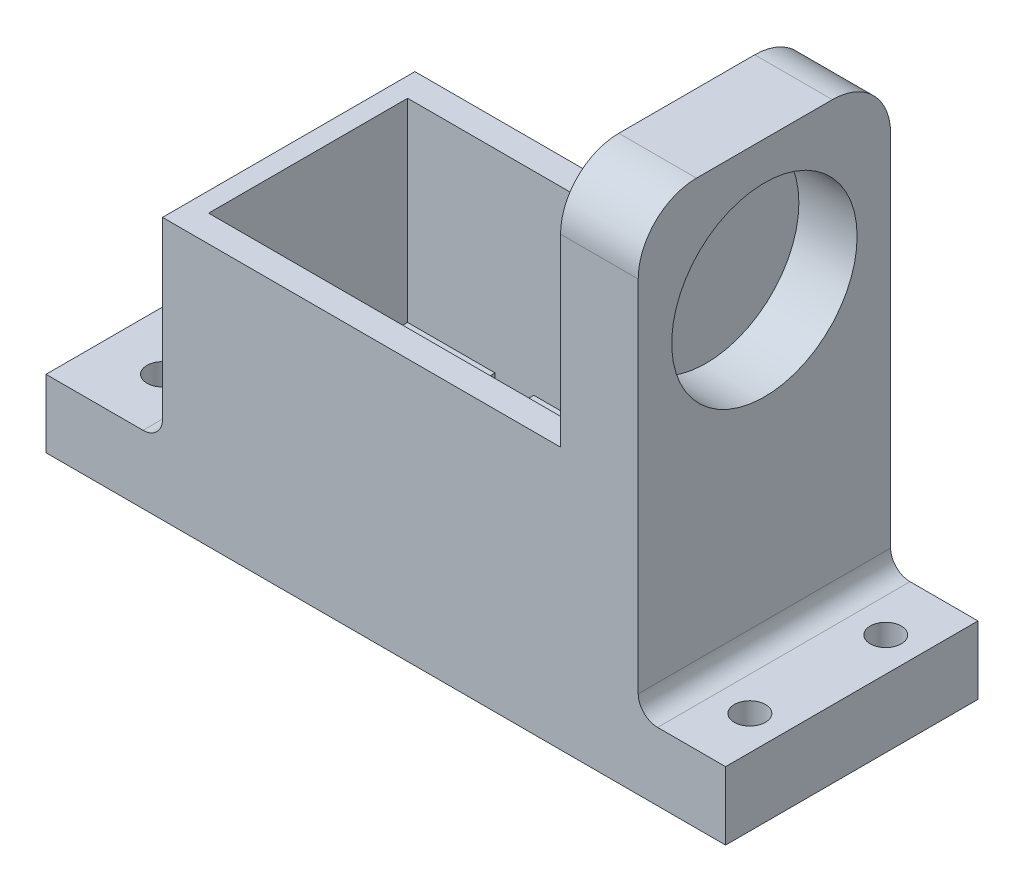
ISO-10303-21;
HEADER;
FILE_DESCRIPTION(('STEP AP214'),'2;1');
FILE_NAME('part.step','',(''),(''),'','','');
FILE_SCHEMA(('AUTOMOTIVE_DESIGN { 1 0 10303 214 1 1 1 1 }'));
ENDSEC;
DATA;
#1=APPLICATION_CONTEXT('core data for automotive mechanical design processes');
#2=APPLICATION_PROTOCOL_DEFINITION('international standard','automotive_design',2000,#1);
#3=PRODUCT_CONTEXT('',#1,'mechanical');
#4=PRODUCT('Part','Part','',(#3));
#5=PRODUCT_RELATED_PRODUCT_CATEGORY('part','',(#4));
#6=PRODUCT_DEFINITION_FORMATION('','',#4);
#7=PRODUCT_DEFINITION_CONTEXT('part definition',#1,'design');
#8=PRODUCT_DEFINITION('design','',#6,#7);
#9=PRODUCT_DEFINITION_SHAPE('','',#8);
#10=(LENGTH_UNIT() NAMED_UNIT(*) SI_UNIT(.MILLI.,.METRE.));
#11=(NAMED_UNIT(*) PLANE_ANGLE_UNIT() SI_UNIT($,.RADIAN.));
#12=(NAMED_UNIT(*) SI_UNIT($,.STERADIAN.) SOLID_ANGLE_UNIT());
#13=UNCERTAINTY_MEASURE_WITH_UNIT(LENGTH_MEASURE(1.E-05),#10,'distance_accuracy_value','');
#14=(GEOMETRIC_REPRESENTATION_CONTEXT(3) GLOBAL_UNCERTAINTY_ASSIGNED_CONTEXT((#13)) GLOBAL_UNIT_ASSIGNED_CONTEXT((#10,
#11,#12)) REPRESENTATION_CONTEXT('',''));
#15=CARTESIAN_POINT('',(0.,0.,0.));
#16=DIRECTION('',(0.,0.,1.));
#17=DIRECTION('',(1.,0.,0.));
#18=AXIS2_PLACEMENT_3D('',#15,#16,#17);
#19=CARTESIAN_POINT('',(0.,7.,0.));
#20=DIRECTION('',(0.,-1.,0.));
#21=DIRECTION('',(0.,0.,-1.));
#22=AXIS2_PLACEMENT_3D('',#19,#20,#21);
#23=PLANE('',#22);
#24=DIRECTION('',(0.,0.,1.));
#25=VECTOR('',#24,1.);
#26=CARTESIAN_POINT('',(23.,7.,-23.25));
#27=LINE('',#26,#25);
#28=CARTESIAN_POINT('',(23.,7.,-23.25));
#29=VERTEX_POINT('',#28);
#30=CARTESIAN_POINT('',(23.,7.,-2.75000000000001));
#31=VERTEX_POINT('',#30);
#32=EDGE_CURVE('E216',#29,#31,#27,.T.);
#33=ORIENTED_EDGE('',*,*,#32,.F.);
#34=DIRECTION('',(1.,0.,0.));
#35=VECTOR('',#34,1.);
#36=CARTESIAN_POINT('',(53.,7.,-23.25));
#37=LINE('',#36,#35);
#38=CARTESIAN_POINT('',(14.,7.,-23.25));
#39=VERTEX_POINT('',#38);
#40=EDGE_CURVE('E209',#39,#29,#37,.T.);
#41=ORIENTED_EDGE('',*,*,#40,.F.);
#42=DIRECTION('',(0.,0.,-1.));
#43=VECTOR('',#42,1.);
#44=CARTESIAN_POINT('',(14.,7.,-23.25));
#45=LINE('',#44,#43);
#46=CARTESIAN_POINT('',(14.,7.,-2.75));
#47=VERTEX_POINT('',#46);
#48=EDGE_CURVE('E241',#47,#39,#45,.T.);
#49=ORIENTED_EDGE('',*,*,#48,.F.);
#50=DIRECTION('',(-1.,0.,0.));
#51=VECTOR('',#50,1.);
#52=CARTESIAN_POINT('',(14.,7.,-2.75));
#53=LINE('',#52,#51);
#54=EDGE_CURVE('E199',#31,#47,#53,.T.);
#55=ORIENTED_EDGE('',*,*,#54,.F.);
#56=EDGE_LOOP('',(#33,#41,#49,#55));
#57=FACE_BOUND('',#56,.T.);
#58=ADVANCED_FACE('F34',(#57),#23,.F.);
#59=CARTESIAN_POINT('',(52.,7.,-2.75));
#60=VERTEX_POINT('',#59);
#61=CARTESIAN_POINT('',(27.,7.,-2.75));
#62=VERTEX_POINT('',#61);
#63=EDGE_CURVE('E238',#60,#62,#53,.T.);
#64=ORIENTED_EDGE('',*,*,#63,.F.);
#65=DIRECTION('',(0.,0.,1.));
#66=VECTOR('',#65,1.);
#67=CARTESIAN_POINT('',(52.,7.,-23.25));
#68=LINE('',#67,#66);
#69=CARTESIAN_POINT('',(52.,7.,-23.25));
#70=VERTEX_POINT('',#69);
#71=EDGE_CURVE('E425',#60,#70,#68,.F.);
#72=ORIENTED_EDGE('',*,*,#71,.T.);
#73=CARTESIAN_POINT('',(27.,7.,-23.25));
#74=VERTEX_POINT('',#73);
#75=EDGE_CURVE('E257',#74,#70,#37,.T.);
#76=ORIENTED_EDGE('',*,*,#75,.F.);
#77=DIRECTION('',(0.,0.,-1.));
#78=VECTOR('',#77,1.);
#79=CARTESIAN_POINT('',(27.,7.,-2.75000000000001));
#80=LINE('',#79,#78);
#81=EDGE_CURVE('E210',#62,#74,#80,.T.);
#82=ORIENTED_EDGE('',*,*,#81,.F.);
#83=EDGE_LOOP('',(#64,#72,#76,#82));
#84=FACE_BOUND('',#83,.T.);
#85=ADVANCED_FACE('F440',(#84),#23,.F.);
#86=CARTESIAN_POINT('',(6.,7.,-6.00000000000001));
#87=DIRECTION('',(0.,1.,0.));
#88=DIRECTION('',(0.,0.,-1.));
#89=AXIS2_PLACEMENT_3D('',#86,#87,#88);
#90=CIRCLE('',#89,1.6);
#91=CARTESIAN_POINT('',(6.,7.,-7.60000000000001));
#92=VERTEX_POINT('',#91);
#93=EDGE_CURVE('E499',#92,#92,#90,.T.);
#94=ORIENTED_EDGE('',*,*,#93,.F.);
#95=EDGE_LOOP('',(#94));
#96=FACE_BOUND('',#95,.T.);
#97=CARTESIAN_POINT('',(6.,7.,-20.));
#98=DIRECTION('',(0.,1.,0.));
#99=DIRECTION('',(0.,0.,1.));
#100=AXIS2_PLACEMENT_3D('',#97,#98,#99);
#101=CIRCLE('',#100,1.6);
#102=CARTESIAN_POINT('',(6.,7.,-18.4));
#103=VERTEX_POINT('',#102);
#104=EDGE_CURVE('E482',#103,#103,#101,.T.);
#105=ORIENTED_EDGE('',*,*,#104,.F.);
#106=EDGE_LOOP('',(#105));
#107=FACE_BOUND('',#106,.T.);
#108=DIRECTION('',(1.,0.,0.));
#109=VECTOR('',#108,1.);
#110=CARTESIAN_POINT('',(70.,7.,0.));
#111=LINE('',#110,#109);
#112=CARTESIAN_POINT('',(0.,7.,0.));
#113=VERTEX_POINT('',#112);
#114=CARTESIAN_POINT('',(10.,7.,0.));
#115=VERTEX_POINT('',#114);
#116=EDGE_CURVE('E296',#113,#115,#111,.T.);
#117=ORIENTED_EDGE('',*,*,#116,.T.);
#118=DIRECTION('',(0.,0.,1.));
#119=VECTOR('',#118,1.);
#120=CARTESIAN_POINT('',(10.,7.,-26.));
#121=LINE('',#120,#119);
#122=CARTESIAN_POINT('',(10.,7.,-26.));
#123=VERTEX_POINT('',#122);
#124=EDGE_CURVE('E317',#115,#123,#121,.F.);
#125=ORIENTED_EDGE('',*,*,#124,.T.);
#126=DIRECTION('',(-1.,0.,0.));
#127=VECTOR('',#126,1.);
#128=CARTESIAN_POINT('',(0.,7.,-26.));
#129=LINE('',#128,#127);
#130=CARTESIAN_POINT('',(0.,7.,-26.));
#131=VERTEX_POINT('',#130);
#132=EDGE_CURVE('E305',#123,#131,#129,.T.);
#133=ORIENTED_EDGE('',*,*,#132,.T.);
#134=DIRECTION('',(0.,0.,1.));
#135=VECTOR('',#134,1.);
#136=CARTESIAN_POINT('',(0.,7.,0.));
#137=LINE('',#136,#135);
#138=EDGE_CURVE('E304',#131,#113,#137,.T.);
#139=ORIENTED_EDGE('',*,*,#138,.T.);
#140=EDGE_LOOP('',(#117,#125,#133,#139));
#141=FACE_BOUND('',#140,.T.);
#142=ADVANCED_FACE('F414',(#96,#107,#141),#23,.F.);
#143=CARTESIAN_POINT('',(53.,52.,-26.));
#144=DIRECTION('',(1.,0.,0.));
#145=DIRECTION('',(0.,0.,-1.));
#146=AXIS2_PLACEMENT_3D('',#143,#144,#145);
#147=PLANE('',#146);
#148=DIRECTION('',(0.,0.,1.));
#149=VECTOR('',#148,1.);
#150=CARTESIAN_POINT('',(53.,52.,-26.));
#151=LINE('',#150,#149);
#152=CARTESIAN_POINT('',(53.,52.,-20.));
#153=VERTEX_POINT('',#152);
#154=CARTESIAN_POINT('',(53.,52.,-6.));
#155=VERTEX_POINT('',#154);
#156=EDGE_CURVE('E279',#153,#155,#151,.T.);
#157=ORIENTED_EDGE('',*,*,#156,.F.);
#158=CARTESIAN_POINT('',(53.,46.,-20.));
#159=DIRECTION('',(1.,0.,0.));
#160=DIRECTION('',(0.,0.,-1.));
#161=AXIS2_PLACEMENT_3D('',#158,#159,#160);
#162=CIRCLE('',#161,6.);
#163=CARTESIAN_POINT('',(53.,46.,-26.));
#164=VERTEX_POINT('',#163);
#165=EDGE_CURVE('E353',#153,#164,#162,.F.);
#166=ORIENTED_EDGE('',*,*,#165,.T.);
#167=DIRECTION('',(0.,-1.,0.));
#168=VECTOR('',#167,1.);
#169=CARTESIAN_POINT('',(53.,52.,-26.));
#170=LINE('',#169,#168);
#171=CARTESIAN_POINT('',(53.,27.,-26.));
#172=VERTEX_POINT('',#171);
#173=EDGE_CURVE('E344',#164,#172,#170,.T.);
#174=ORIENTED_EDGE('',*,*,#173,.T.);
#175=DIRECTION('',(0.,0.,-1.));
#176=VECTOR('',#175,1.);
#177=CARTESIAN_POINT('',(53.,27.,-26.));
#178=LINE('',#177,#176);
#179=CARTESIAN_POINT('',(53.,27.,-23.25));
#180=VERTEX_POINT('',#179);
#181=EDGE_CURVE('E256',#180,#172,#178,.T.);
#182=ORIENTED_EDGE('',*,*,#181,.F.);
#183=DIRECTION('',(0.,-1.,0.));
#184=VECTOR('',#183,1.);
#185=CARTESIAN_POINT('',(53.,27.,-23.25));
#186=LINE('',#185,#184);
#187=CARTESIAN_POINT('',(53.,8.,-23.25));
#188=VERTEX_POINT('',#187);
#189=EDGE_CURVE('E261',#180,#188,#186,.T.);
#190=ORIENTED_EDGE('',*,*,#189,.T.);
#191=DIRECTION('',(0.,0.,1.));
#192=VECTOR('',#191,1.);
#193=CARTESIAN_POINT('',(53.,8.,-2.75000000000001));
#194=LINE('',#193,#192);
#195=CARTESIAN_POINT('',(53.,8.,-2.75));
#196=VERTEX_POINT('',#195);
#197=EDGE_CURVE('E233',#188,#196,#194,.T.);
#198=ORIENTED_EDGE('',*,*,#197,.T.);
#199=DIRECTION('',(0.,-1.,0.));
#200=VECTOR('',#199,1.);
#201=CARTESIAN_POINT('',(53.,27.,-2.75));
#202=LINE('',#201,#200);
#203=CARTESIAN_POINT('',(53.,27.,-2.75));
#204=VERTEX_POINT('',#203);
#205=EDGE_CURVE('E270',#204,#196,#202,.T.);
#206=ORIENTED_EDGE('',*,*,#205,.F.);
#207=DIRECTION('',(0.,0.,-1.));
#208=VECTOR('',#207,1.);
#209=CARTESIAN_POINT('',(53.,27.,-2.75));
#210=LINE('',#209,#208);
#211=CARTESIAN_POINT('',(53.,27.,0.));
#212=VERTEX_POINT('',#211);
#213=EDGE_CURVE('E452',#212,#204,#210,.T.);
#214=ORIENTED_EDGE('',*,*,#213,.F.);
#215=DIRECTION('',(0.,-1.,0.));
#216=VECTOR('',#215,1.);
#217=CARTESIAN_POINT('',(53.,52.,0.));
#218=LINE('',#217,#216);
#219=CARTESIAN_POINT('',(53.,46.,0.));
#220=VERTEX_POINT('',#219);
#221=EDGE_CURVE('E342',#220,#212,#218,.T.);
#222=ORIENTED_EDGE('',*,*,#221,.F.);
#223=CARTESIAN_POINT('',(53.,46.,-6.));
#224=DIRECTION('',(1.,0.,0.));
#225=DIRECTION('',(0.,0.,-1.));
#226=AXIS2_PLACEMENT_3D('',#223,#224,#225);
#227=CIRCLE('',#226,6.);
#228=EDGE_CURVE('E341',#220,#155,#227,.F.);
#229=ORIENTED_EDGE('',*,*,#228,.T.);
#230=EDGE_LOOP('',(#157,#166,#174,#182,#190,#198,#206,#214,#222,#229));
#231=FACE_BOUND('',#230,.T.);
#232=ADVANCED_FACE('F368',(#231),#147,.F.);
#233=CARTESIAN_POINT('',(66.5,7.,-6.));
#234=DIRECTION('',(0.,1.,0.));
#235=DIRECTION('',(0.,0.,-1.));
#236=AXIS2_PLACEMENT_3D('',#233,#234,#235);
#237=CIRCLE('',#236,1.60000000000001);
#238=CARTESIAN_POINT('',(66.5,7.,-7.6));
#239=VERTEX_POINT('',#238);
#240=EDGE_CURVE('E493',#239,#239,#237,.T.);
#241=ORIENTED_EDGE('',*,*,#240,.F.);
#242=EDGE_LOOP('',(#241));
#243=FACE_BOUND('',#242,.T.);
#244=CARTESIAN_POINT('',(66.5,7.,-20.));
#245=DIRECTION('',(0.,1.,0.));
#246=DIRECTION('',(0.,0.,1.));
#247=AXIS2_PLACEMENT_3D('',#244,#245,#246);
#248=CIRCLE('',#247,1.6);
#249=CARTESIAN_POINT('',(66.5,7.,-18.4));
#250=VERTEX_POINT('',#249);
#251=EDGE_CURVE('E488',#250,#250,#248,.T.);
#252=ORIENTED_EDGE('',*,*,#251,.F.);
#253=EDGE_LOOP('',(#252));
#254=FACE_BOUND('',#253,.T.);
#255=CARTESIAN_POINT('',(70.,7.,-26.));
#256=VERTEX_POINT('',#255);
#257=CARTESIAN_POINT('',(63.,7.,-26.));
#258=VERTEX_POINT('',#257);
#259=EDGE_CURVE('E301',#256,#258,#129,.T.);
#260=ORIENTED_EDGE('',*,*,#259,.T.);
#261=DIRECTION('',(0.,0.,-1.));
#262=VECTOR('',#261,1.);
#263=CARTESIAN_POINT('',(63.,7.,0.));
#264=LINE('',#263,#262);
#265=CARTESIAN_POINT('',(63.,7.,0.));
#266=VERTEX_POINT('',#265);
#267=EDGE_CURVE('E320',#258,#266,#264,.F.);
#268=ORIENTED_EDGE('',*,*,#267,.T.);
#269=CARTESIAN_POINT('',(70.,7.,0.));
#270=VERTEX_POINT('',#269);
#271=EDGE_CURVE('E292',#266,#270,#111,.T.);
#272=ORIENTED_EDGE('',*,*,#271,.T.);
#273=DIRECTION('',(0.,0.,-1.));
#274=VECTOR('',#273,1.);
#275=CARTESIAN_POINT('',(70.,7.,-26.));
#276=LINE('',#275,#274);
#277=EDGE_CURVE('E288',#270,#256,#276,.T.);
#278=ORIENTED_EDGE('',*,*,#277,.T.);
#279=EDGE_LOOP('',(#260,#268,#272,#278));
#280=FACE_BOUND('',#279,.T.);
#281=ADVANCED_FACE('F383',(#243,#254,#280),#23,.F.);
#282=CARTESIAN_POINT('',(70.,7.,0.));
#283=DIRECTION('',(0.,0.,-1.));
#284=DIRECTION('',(-1.,0.,0.));
#285=AXIS2_PLACEMENT_3D('',#282,#283,#284);
#286=PLANE('',#285);
#287=DIRECTION('',(0.,-1.,0.));
#288=VECTOR('',#287,1.);
#289=CARTESIAN_POINT('',(61.,52.,0.));
#290=LINE('',#289,#288);
#291=CARTESIAN_POINT('',(61.,46.,0.));
#292=VERTEX_POINT('',#291);
#293=CARTESIAN_POINT('',(61.,9.00000000000001,0.));
#294=VERTEX_POINT('',#293);
#295=EDGE_CURVE('E345',#292,#294,#290,.T.);
#296=ORIENTED_EDGE('',*,*,#295,.F.);
#297=DIRECTION('',(1.,0.,0.));
#298=VECTOR('',#297,1.);
#299=CARTESIAN_POINT('',(53.,46.,0.));
#300=LINE('',#299,#298);
#301=EDGE_CURVE('E11',#292,#220,#300,.F.);
#302=ORIENTED_EDGE('',*,*,#301,.T.);
#303=ORIENTED_EDGE('',*,*,#221,.T.);
#304=DIRECTION('',(1.,0.,0.));
#305=VECTOR('',#304,1.);
#306=CARTESIAN_POINT('',(12.,27.,0.));
#307=LINE('',#306,#305);
#308=CARTESIAN_POINT('',(12.,27.,0.));
#309=VERTEX_POINT('',#308);
#310=EDGE_CURVE('E456',#309,#212,#307,.T.);
#311=ORIENTED_EDGE('',*,*,#310,.F.);
#312=DIRECTION('',(0.,-1.,0.));
#313=VECTOR('',#312,1.);
#314=CARTESIAN_POINT('',(12.,27.,0.));
#315=LINE('',#314,#313);
#316=CARTESIAN_POINT('',(12.,9.,0.));
#317=VERTEX_POINT('',#316);
#318=EDGE_CURVE('E273',#309,#317,#315,.T.);
#319=ORIENTED_EDGE('',*,*,#318,.T.);
#320=CARTESIAN_POINT('',(10.,9.,0.));
#321=DIRECTION('',(0.,0.,-1.));
#322=DIRECTION('',(-1.,0.,0.));
#323=AXIS2_PLACEMENT_3D('',#320,#321,#322);
#324=CIRCLE('',#323,2.);
#325=EDGE_CURVE('E322',#317,#115,#324,.T.);
#326=ORIENTED_EDGE('',*,*,#325,.T.);
#327=ORIENTED_EDGE('',*,*,#116,.F.);
#328=DIRECTION('',(0.,-1.,0.));
#329=VECTOR('',#328,1.);
#330=CARTESIAN_POINT('',(0.,7.,0.));
#331=LINE('',#330,#329);
#332=CARTESIAN_POINT('',(0.,0.,0.));
#333=VERTEX_POINT('',#332);
#334=EDGE_CURVE('E394',#113,#333,#331,.T.);
#335=ORIENTED_EDGE('',*,*,#334,.T.);
#336=DIRECTION('',(1.,0.,0.));
#337=VECTOR('',#336,1.);
#338=CARTESIAN_POINT('',(70.,0.,0.));
#339=LINE('',#338,#337);
#340=CARTESIAN_POINT('',(70.,0.,0.));
#341=VERTEX_POINT('',#340);
#342=EDGE_CURVE('E347',#333,#341,#339,.T.);
#343=ORIENTED_EDGE('',*,*,#342,.T.);
#344=DIRECTION('',(0.,-1.,0.));
#345=VECTOR('',#344,1.);
#346=CARTESIAN_POINT('',(70.,7.,0.));
#347=LINE('',#346,#345);
#348=EDGE_CURVE('E237',#270,#341,#347,.T.);
#349=ORIENTED_EDGE('',*,*,#348,.F.);
#350=ORIENTED_EDGE('',*,*,#271,.F.);
#351=CARTESIAN_POINT('',(63.,9.,0.));
#352=DIRECTION('',(0.,0.,-1.));
#353=DIRECTION('',(-1.,0.,0.));
#354=AXIS2_PLACEMENT_3D('',#351,#352,#353);
#355=CIRCLE('',#354,2.);
#356=EDGE_CURVE('E332',#266,#294,#355,.T.);
#357=ORIENTED_EDGE('',*,*,#356,.T.);
#358=EDGE_LOOP('',(#296,#302,#303,#311,#319,#326,#327,#335,#343,#349,#350,#357));
#359=FACE_BOUND('',#358,.T.);
#360=ADVANCED_FACE('F373',(#359),#286,.F.);
#361=CARTESIAN_POINT('',(70.,7.,-26.));
#362=DIRECTION('',(-1.,0.,0.));
#363=DIRECTION('',(0.,0.,1.));
#364=AXIS2_PLACEMENT_3D('',#361,#362,#363);
#365=PLANE('',#364);
#366=DIRECTION('',(0.,0.,-1.));
#367=VECTOR('',#366,1.);
#368=CARTESIAN_POINT('',(70.,0.,-26.));
#369=LINE('',#368,#367);
#370=CARTESIAN_POINT('',(70.,0.,-26.));
#371=VERTEX_POINT('',#370);
#372=EDGE_CURVE('E390',#341,#371,#369,.T.);
#373=ORIENTED_EDGE('',*,*,#372,.T.);
#374=DIRECTION('',(0.,-1.,0.));
#375=VECTOR('',#374,1.);
#376=CARTESIAN_POINT('',(70.,7.,-26.));
#377=LINE('',#376,#375);
#378=EDGE_CURVE('E388',#256,#371,#377,.T.);
#379=ORIENTED_EDGE('',*,*,#378,.F.);
#380=ORIENTED_EDGE('',*,*,#277,.F.);
#381=ORIENTED_EDGE('',*,*,#348,.T.);
#382=EDGE_LOOP('',(#373,#379,#380,#381));
#383=FACE_BOUND('',#382,.T.);
#384=ADVANCED_FACE('F389',(#383),#365,.F.);
#385=CARTESIAN_POINT('',(0.,7.,-26.));
#386=DIRECTION('',(0.,0.,1.));
#387=DIRECTION('',(1.,0.,0.));
#388=AXIS2_PLACEMENT_3D('',#385,#386,#387);
#389=PLANE('',#388);
#390=ORIENTED_EDGE('',*,*,#173,.F.);
#391=DIRECTION('',(-1.,0.,0.));
#392=VECTOR('',#391,1.);
#393=CARTESIAN_POINT('',(61.,46.,-26.));
#394=LINE('',#393,#392);
#395=CARTESIAN_POINT('',(61.,46.,-26.));
#396=VERTEX_POINT('',#395);
#397=EDGE_CURVE('E57',#164,#396,#394,.F.);
#398=ORIENTED_EDGE('',*,*,#397,.T.);
#399=DIRECTION('',(0.,-1.,0.));
#400=VECTOR('',#399,1.);
#401=CARTESIAN_POINT('',(61.,52.,-26.));
#402=LINE('',#401,#400);
#403=CARTESIAN_POINT('',(61.,9.00000000000001,-26.));
#404=VERTEX_POINT('',#403);
#405=EDGE_CURVE('E285',#396,#404,#402,.T.);
#406=ORIENTED_EDGE('',*,*,#405,.T.);
#407=CARTESIAN_POINT('',(63.,9.,-26.));
#408=DIRECTION('',(0.,0.,1.));
#409=DIRECTION('',(1.,0.,0.));
#410=AXIS2_PLACEMENT_3D('',#407,#408,#409);
#411=CIRCLE('',#410,2.);
#412=EDGE_CURVE('E330',#404,#258,#411,.T.);
#413=ORIENTED_EDGE('',*,*,#412,.T.);
#414=ORIENTED_EDGE('',*,*,#259,.F.);
#415=ORIENTED_EDGE('',*,*,#378,.T.);
#416=DIRECTION('',(-1.,0.,0.));
#417=VECTOR('',#416,1.);
#418=CARTESIAN_POINT('',(0.,0.,-26.));
#419=LINE('',#418,#417);
#420=CARTESIAN_POINT('',(0.,0.,-26.));
#421=VERTEX_POINT('',#420);
#422=EDGE_CURVE('E401',#371,#421,#419,.T.);
#423=ORIENTED_EDGE('',*,*,#422,.T.);
#424=DIRECTION('',(0.,-1.,0.));
#425=VECTOR('',#424,1.);
#426=CARTESIAN_POINT('',(0.,7.,-26.));
#427=LINE('',#426,#425);
#428=EDGE_CURVE('E392',#131,#421,#427,.T.);
#429=ORIENTED_EDGE('',*,*,#428,.F.);
#430=ORIENTED_EDGE('',*,*,#132,.F.);
#431=CARTESIAN_POINT('',(10.,9.,-26.));
#432=DIRECTION('',(0.,0.,1.));
#433=DIRECTION('',(1.,0.,0.));
#434=AXIS2_PLACEMENT_3D('',#431,#432,#433);
#435=CIRCLE('',#434,2.);
#436=CARTESIAN_POINT('',(12.,9.,-26.));
#437=VERTEX_POINT('',#436);
#438=EDGE_CURVE('E326',#123,#437,#435,.T.);
#439=ORIENTED_EDGE('',*,*,#438,.T.);
#440=DIRECTION('',(0.,-1.,0.));
#441=VECTOR('',#440,1.);
#442=CARTESIAN_POINT('',(12.,27.,-26.));
#443=LINE('',#442,#441);
#444=CARTESIAN_POINT('',(12.,27.,-26.));
#445=VERTEX_POINT('',#444);
#446=EDGE_CURVE('E276',#445,#437,#443,.T.);
#447=ORIENTED_EDGE('',*,*,#446,.F.);
#448=DIRECTION('',(-1.,0.,0.));
#449=VECTOR('',#448,1.);
#450=CARTESIAN_POINT('',(53.,27.,-26.));
#451=LINE('',#450,#449);
#452=EDGE_CURVE('E461',#172,#445,#451,.T.);
#453=ORIENTED_EDGE('',*,*,#452,.F.);
#454=EDGE_LOOP('',(#390,#398,#406,#413,#414,#415,#423,#429,#430,#439,#447,#453));
#455=FACE_BOUND('',#454,.T.);
#456=ADVANCED_FACE('F381',(#455),#389,.F.);
#457=CARTESIAN_POINT('',(0.,7.,0.));
#458=DIRECTION('',(1.,0.,0.));
#459=DIRECTION('',(0.,0.,-1.));
#460=AXIS2_PLACEMENT_3D('',#457,#458,#459);
#461=PLANE('',#460);
#462=DIRECTION('',(0.,0.,1.));
#463=VECTOR('',#462,1.);
#464=CARTESIAN_POINT('',(0.,0.,0.));
#465=LINE('',#464,#463);
#466=EDGE_CURVE('E399',#421,#333,#465,.T.);
#467=ORIENTED_EDGE('',*,*,#466,.T.);
#468=ORIENTED_EDGE('',*,*,#334,.F.);
#469=ORIENTED_EDGE('',*,*,#138,.F.);
#470=ORIENTED_EDGE('',*,*,#428,.T.);
#471=EDGE_LOOP('',(#467,#468,#469,#470));
#472=FACE_BOUND('',#471,.T.);
#473=ADVANCED_FACE('F412',(#472),#461,.F.);
#474=CARTESIAN_POINT('',(0.,0.,0.));
#475=DIRECTION('',(0.,-1.,0.));
#476=DIRECTION('',(0.,0.,-1.));
#477=AXIS2_PLACEMENT_3D('',#474,#475,#476);
#478=PLANE('',#477);
#479=CARTESIAN_POINT('',(6.,0.,-6.00000000000001));
#480=DIRECTION('',(0.,-1.,0.));
#481=DIRECTION('',(0.,0.,-1.));
#482=AXIS2_PLACEMENT_3D('',#479,#480,#481);
#483=CIRCLE('',#482,1.6);
#484=CARTESIAN_POINT('',(6.,0.,-7.60000000000001));
#485=VERTEX_POINT('',#484);
#486=EDGE_CURVE('E502',#485,#485,#483,.F.);
#487=ORIENTED_EDGE('',*,*,#486,.T.);
#488=EDGE_LOOP('',(#487));
#489=FACE_BOUND('',#488,.T.);
#490=CARTESIAN_POINT('',(66.5,0.,-6.));
#491=DIRECTION('',(0.,-1.,0.));
#492=DIRECTION('',(0.,0.,-1.));
#493=AXIS2_PLACEMENT_3D('',#490,#491,#492);
#494=CIRCLE('',#493,1.60000000000001);
#495=CARTESIAN_POINT('',(66.5,0.,-7.6));
#496=VERTEX_POINT('',#495);
#497=EDGE_CURVE('E496',#496,#496,#494,.F.);
#498=ORIENTED_EDGE('',*,*,#497,.T.);
#499=EDGE_LOOP('',(#498));
#500=FACE_BOUND('',#499,.T.);
#501=CARTESIAN_POINT('',(66.5,0.,-20.));
#502=DIRECTION('',(0.,-1.,0.));
#503=DIRECTION('',(0.,0.,-1.));
#504=AXIS2_PLACEMENT_3D('',#501,#502,#503);
#505=CIRCLE('',#504,1.6);
#506=CARTESIAN_POINT('',(66.5,0.,-21.6));
#507=VERTEX_POINT('',#506);
#508=EDGE_CURVE('E490',#507,#507,#505,.F.);
#509=ORIENTED_EDGE('',*,*,#508,.T.);
#510=EDGE_LOOP('',(#509));
#511=FACE_BOUND('',#510,.T.);
#512=CARTESIAN_POINT('',(6.,0.,-20.));
#513=DIRECTION('',(0.,-1.,0.));
#514=DIRECTION('',(0.,0.,-1.));
#515=AXIS2_PLACEMENT_3D('',#512,#513,#514);
#516=CIRCLE('',#515,1.6);
#517=CARTESIAN_POINT('',(6.,0.,-21.6));
#518=VERTEX_POINT('',#517);
#519=EDGE_CURVE('E484',#518,#518,#516,.F.);
#520=ORIENTED_EDGE('',*,*,#519,.T.);
#521=EDGE_LOOP('',(#520));
#522=FACE_BOUND('',#521,.T.);
#523=DIRECTION('',(-1.,0.,0.));
#524=VECTOR('',#523,1.);
#525=CARTESIAN_POINT('',(27.,0.,-23.25));
#526=LINE('',#525,#524);
#527=CARTESIAN_POINT('',(27.,0.,-23.25));
#528=VERTEX_POINT('',#527);
#529=CARTESIAN_POINT('',(23.,0.,-23.25));
#530=VERTEX_POINT('',#529);
#531=EDGE_CURVE('E206',#528,#530,#526,.T.);
#532=ORIENTED_EDGE('',*,*,#531,.T.);
#533=DIRECTION('',(0.,0.,1.));
#534=VECTOR('',#533,1.);
#535=CARTESIAN_POINT('',(23.,0.,-23.25));
#536=LINE('',#535,#534);
#537=CARTESIAN_POINT('',(23.,0.,-2.75000000000001));
#538=VERTEX_POINT('',#537);
#539=EDGE_CURVE('E188',#530,#538,#536,.T.);
#540=ORIENTED_EDGE('',*,*,#539,.T.);
#541=DIRECTION('',(1.,0.,0.));
#542=VECTOR('',#541,1.);
#543=CARTESIAN_POINT('',(23.,0.,-2.75000000000001));
#544=LINE('',#543,#542);
#545=CARTESIAN_POINT('',(27.,0.,-2.75000000000001));
#546=VERTEX_POINT('',#545);
#547=EDGE_CURVE('E219',#538,#546,#544,.T.);
#548=ORIENTED_EDGE('',*,*,#547,.T.);
#549=DIRECTION('',(0.,0.,-1.));
#550=VECTOR('',#549,1.);
#551=CARTESIAN_POINT('',(27.,0.,-2.75000000000001));
#552=LINE('',#551,#550);
#553=EDGE_CURVE('E215',#546,#528,#552,.T.);
#554=ORIENTED_EDGE('',*,*,#553,.T.);
#555=EDGE_LOOP('',(#532,#540,#548,#554));
#556=FACE_BOUND('',#555,.T.);
#557=ORIENTED_EDGE('',*,*,#342,.F.);
#558=ORIENTED_EDGE('',*,*,#466,.F.);
#559=ORIENTED_EDGE('',*,*,#422,.F.);
#560=ORIENTED_EDGE('',*,*,#372,.F.);
#561=EDGE_LOOP('',(#557,#558,#559,#560));
#562=FACE_BOUND('',#561,.T.);
#563=ADVANCED_FACE('F213',(#489,#500,#511,#522,#556,#562),#478,.T.);
#564=CARTESIAN_POINT('',(61.,52.,0.));
#565=DIRECTION('',(-1.,0.,0.));
#566=DIRECTION('',(0.,0.,1.));
#567=AXIS2_PLACEMENT_3D('',#564,#565,#566);
#568=PLANE('',#567);
#569=CARTESIAN_POINT('',(61.,38.53,-13.));
#570=DIRECTION('',(1.,0.,0.));
#571=DIRECTION('',(0.,0.,-1.));
#572=AXIS2_PLACEMENT_3D('',#569,#570,#571);
#573=CIRCLE('',#572,9.55);
#574=CARTESIAN_POINT('',(61.,38.53,-22.55));
#575=VERTEX_POINT('',#574);
#576=EDGE_CURVE('E508',#575,#575,#573,.T.);
#577=ORIENTED_EDGE('',*,*,#576,.F.);
#578=EDGE_LOOP('',(#577));
#579=FACE_BOUND('',#578,.T.);
#580=ORIENTED_EDGE('',*,*,#405,.F.);
#581=CARTESIAN_POINT('',(61.,46.,-20.));
#582=DIRECTION('',(-1.,0.,0.));
#583=DIRECTION('',(0.,0.,1.));
#584=AXIS2_PLACEMENT_3D('',#581,#582,#583);
#585=CIRCLE('',#584,6.);
#586=CARTESIAN_POINT('',(61.,52.,-20.));
#587=VERTEX_POINT('',#586);
#588=EDGE_CURVE('E42',#396,#587,#585,.F.);
#589=ORIENTED_EDGE('',*,*,#588,.T.);
#590=DIRECTION('',(0.,0.,-1.));
#591=VECTOR('',#590,1.);
#592=CARTESIAN_POINT('',(61.,52.,0.));
#593=LINE('',#592,#591);
#594=CARTESIAN_POINT('',(61.,52.,-5.99999999999999));
#595=VERTEX_POINT('',#594);
#596=EDGE_CURVE('E282',#595,#587,#593,.T.);
#597=ORIENTED_EDGE('',*,*,#596,.F.);
#598=CARTESIAN_POINT('',(61.,46.,-6.));
#599=DIRECTION('',(-1.,0.,0.));
#600=DIRECTION('',(0.,0.,1.));
#601=AXIS2_PLACEMENT_3D('',#598,#599,#600);
#602=CIRCLE('',#601,6.);
#603=EDGE_CURVE('E49',#595,#292,#602,.F.);
#604=ORIENTED_EDGE('',*,*,#603,.T.);
#605=ORIENTED_EDGE('',*,*,#295,.T.);
#606=DIRECTION('',(0.,0.,-1.));
#607=VECTOR('',#606,1.);
#608=CARTESIAN_POINT('',(61.,9.,-26.));
#609=LINE('',#608,#607);
#610=EDGE_CURVE('E318',#294,#404,#609,.T.);
#611=ORIENTED_EDGE('',*,*,#610,.T.);
#612=EDGE_LOOP('',(#580,#589,#597,#604,#605,#611));
#613=FACE_BOUND('',#612,.T.);
#614=ADVANCED_FACE('F357',(#579,#613),#568,.F.);
#615=CARTESIAN_POINT('',(0.,52.,0.));
#616=DIRECTION('',(0.,1.,0.));
#617=DIRECTION('',(0.,0.,1.));
#618=AXIS2_PLACEMENT_3D('',#615,#616,#617);
#619=PLANE('',#618);
#620=ORIENTED_EDGE('',*,*,#596,.T.);
#621=DIRECTION('',(-1.,0.,0.));
#622=VECTOR('',#621,1.);
#623=CARTESIAN_POINT('',(53.,52.,-20.));
#624=LINE('',#623,#622);
#625=EDGE_CURVE('E338',#587,#153,#624,.T.);
#626=ORIENTED_EDGE('',*,*,#625,.T.);
#627=ORIENTED_EDGE('',*,*,#156,.T.);
#628=DIRECTION('',(1.,0.,0.));
#629=VECTOR('',#628,1.);
#630=CARTESIAN_POINT('',(61.,52.,-6.));
#631=LINE('',#630,#629);
#632=EDGE_CURVE('E335',#155,#595,#631,.T.);
#633=ORIENTED_EDGE('',*,*,#632,.T.);
#634=EDGE_LOOP('',(#620,#626,#627,#633));
#635=FACE_BOUND('',#634,.T.);
#636=ADVANCED_FACE('F361',(#635),#619,.T.);
#637=CARTESIAN_POINT('',(12.,27.,-26.));
#638=DIRECTION('',(1.,0.,0.));
#639=DIRECTION('',(0.,0.,-1.));
#640=AXIS2_PLACEMENT_3D('',#637,#638,#639);
#641=PLANE('',#640);
#642=ORIENTED_EDGE('',*,*,#446,.T.);
#643=DIRECTION('',(0.,0.,1.));
#644=VECTOR('',#643,1.);
#645=CARTESIAN_POINT('',(12.,9.,0.));
#646=LINE('',#645,#644);
#647=EDGE_CURVE('E315',#437,#317,#646,.T.);
#648=ORIENTED_EDGE('',*,*,#647,.T.);
#649=ORIENTED_EDGE('',*,*,#318,.F.);
#650=DIRECTION('',(0.,0.,1.));
#651=VECTOR('',#650,1.);
#652=CARTESIAN_POINT('',(12.,27.,-26.));
#653=LINE('',#652,#651);
#654=EDGE_CURVE('E459',#445,#309,#653,.T.);
#655=ORIENTED_EDGE('',*,*,#654,.F.);
#656=EDGE_LOOP('',(#642,#648,#649,#655));
#657=FACE_BOUND('',#656,.T.);
#658=ADVANCED_FACE('F466',(#657),#641,.F.);
#659=CARTESIAN_POINT('',(14.,27.,-2.75));
#660=DIRECTION('',(0.,0.,1.));
#661=DIRECTION('',(1.,0.,0.));
#662=AXIS2_PLACEMENT_3D('',#659,#660,#661);
#663=PLANE('',#662);
#664=ORIENTED_EDGE('',*,*,#205,.T.);
#665=CARTESIAN_POINT('',(52.,8.,-2.75));
#666=DIRECTION('',(0.,0.,1.));
#667=DIRECTION('',(1.,0.,0.));
#668=AXIS2_PLACEMENT_3D('',#665,#666,#667);
#669=CIRCLE('',#668,1.);
#670=EDGE_CURVE('E236',#196,#60,#669,.F.);
#671=ORIENTED_EDGE('',*,*,#670,.T.);
#672=ORIENTED_EDGE('',*,*,#63,.T.);
#673=DIRECTION('',(0.,1.,0.));
#674=VECTOR('',#673,1.);
#675=CARTESIAN_POINT('',(27.,-0.00100000000000013,-2.75000000000001));
#676=LINE('',#675,#674);
#677=EDGE_CURVE('E230',#546,#62,#676,.T.);
#678=ORIENTED_EDGE('',*,*,#677,.F.);
#679=ORIENTED_EDGE('',*,*,#547,.F.);
#680=DIRECTION('',(0.,1.,0.));
#681=VECTOR('',#680,1.);
#682=CARTESIAN_POINT('',(23.,-0.00100000000000013,-2.75000000000001));
#683=LINE('',#682,#681);
#684=EDGE_CURVE('E194',#538,#31,#683,.T.);
#685=ORIENTED_EDGE('',*,*,#684,.T.);
#686=ORIENTED_EDGE('',*,*,#54,.T.);
#687=DIRECTION('',(0.,-1.,0.));
#688=VECTOR('',#687,1.);
#689=CARTESIAN_POINT('',(14.,27.,-2.75));
#690=LINE('',#689,#688);
#691=CARTESIAN_POINT('',(14.,27.,-2.75));
#692=VERTEX_POINT('',#691);
#693=EDGE_CURVE('E267',#692,#47,#690,.T.);
#694=ORIENTED_EDGE('',*,*,#693,.F.);
#695=DIRECTION('',(-1.,0.,0.));
#696=VECTOR('',#695,1.);
#697=CARTESIAN_POINT('',(14.,27.,-2.75));
#698=LINE('',#697,#696);
#699=EDGE_CURVE('E450',#204,#692,#698,.T.);
#700=ORIENTED_EDGE('',*,*,#699,.F.);
#701=EDGE_LOOP('',(#664,#671,#672,#678,#679,#685,#686,#694,#700));
#702=FACE_BOUND('',#701,.T.);
#703=ADVANCED_FACE('F433',(#702),#663,.F.);
#704=CARTESIAN_POINT('',(14.,27.,-23.25));
#705=DIRECTION('',(-1.,0.,0.));
#706=DIRECTION('',(0.,0.,1.));
#707=AXIS2_PLACEMENT_3D('',#704,#705,#706);
#708=PLANE('',#707);
#709=ORIENTED_EDGE('',*,*,#48,.T.);
#710=DIRECTION('',(0.,-1.,0.));
#711=VECTOR('',#710,1.);
#712=CARTESIAN_POINT('',(14.,27.,-23.25));
#713=LINE('',#712,#711);
#714=CARTESIAN_POINT('',(14.,27.,-23.25));
#715=VERTEX_POINT('',#714);
#716=EDGE_CURVE('E265',#715,#39,#713,.T.);
#717=ORIENTED_EDGE('',*,*,#716,.F.);
#718=DIRECTION('',(0.,0.,-1.));
#719=VECTOR('',#718,1.);
#720=CARTESIAN_POINT('',(14.,27.,-23.25));
#721=LINE('',#720,#719);
#722=EDGE_CURVE('E449',#692,#715,#721,.T.);
#723=ORIENTED_EDGE('',*,*,#722,.F.);
#724=ORIENTED_EDGE('',*,*,#693,.T.);
#725=EDGE_LOOP('',(#709,#717,#723,#724));
#726=FACE_BOUND('',#725,.T.);
#727=ADVANCED_FACE('F472',(#726),#708,.F.);
#728=CARTESIAN_POINT('',(53.,27.,-23.25));
#729=DIRECTION('',(0.,0.,-1.));
#730=DIRECTION('',(-1.,0.,0.));
#731=AXIS2_PLACEMENT_3D('',#728,#729,#730);
#732=PLANE('',#731);
#733=ORIENTED_EDGE('',*,*,#75,.T.);
#734=CARTESIAN_POINT('',(52.,8.,-23.25));
#735=DIRECTION('',(0.,0.,-1.));
#736=DIRECTION('',(-1.,0.,0.));
#737=AXIS2_PLACEMENT_3D('',#734,#735,#736);
#738=CIRCLE('',#737,1.);
#739=EDGE_CURVE('E424',#70,#188,#738,.F.);
#740=ORIENTED_EDGE('',*,*,#739,.T.);
#741=ORIENTED_EDGE('',*,*,#189,.F.);
#742=DIRECTION('',(1.,0.,0.));
#743=VECTOR('',#742,1.);
#744=CARTESIAN_POINT('',(53.,27.,-23.25));
#745=LINE('',#744,#743);
#746=EDGE_CURVE('E246',#715,#180,#745,.T.);
#747=ORIENTED_EDGE('',*,*,#746,.F.);
#748=ORIENTED_EDGE('',*,*,#716,.T.);
#749=ORIENTED_EDGE('',*,*,#40,.T.);
#750=DIRECTION('',(0.,1.,0.));
#751=VECTOR('',#750,1.);
#752=CARTESIAN_POINT('',(23.,-0.00100000000000013,-23.25));
#753=LINE('',#752,#751);
#754=EDGE_CURVE('E192',#530,#29,#753,.T.);
#755=ORIENTED_EDGE('',*,*,#754,.F.);
#756=ORIENTED_EDGE('',*,*,#531,.F.);
#757=DIRECTION('',(0.,1.,0.));
#758=VECTOR('',#757,1.);
#759=CARTESIAN_POINT('',(27.,-0.00100000000000013,-23.25));
#760=LINE('',#759,#758);
#761=EDGE_CURVE('E200',#528,#74,#760,.T.);
#762=ORIENTED_EDGE('',*,*,#761,.T.);
#763=EDGE_LOOP('',(#733,#740,#741,#747,#748,#749,#755,#756,#762));
#764=FACE_BOUND('',#763,.T.);
#765=ADVANCED_FACE('F205',(#764),#732,.F.);
#766=CARTESIAN_POINT('',(0.,27.,0.));
#767=DIRECTION('',(0.,-1.,0.));
#768=DIRECTION('',(0.,0.,-1.));
#769=AXIS2_PLACEMENT_3D('',#766,#767,#768);
#770=PLANE('',#769);
#771=ORIENTED_EDGE('',*,*,#181,.T.);
#772=ORIENTED_EDGE('',*,*,#452,.T.);
#773=ORIENTED_EDGE('',*,*,#654,.T.);
#774=ORIENTED_EDGE('',*,*,#310,.T.);
#775=ORIENTED_EDGE('',*,*,#213,.T.);
#776=ORIENTED_EDGE('',*,*,#699,.T.);
#777=ORIENTED_EDGE('',*,*,#722,.T.);
#778=ORIENTED_EDGE('',*,*,#746,.T.);
#779=EDGE_LOOP('',(#771,#772,#773,#774,#775,#776,#777,#778));
#780=FACE_BOUND('',#779,.T.);
#781=ADVANCED_FACE('F463',(#780),#770,.F.);
#782=CARTESIAN_POINT('',(27.,-0.00100000000000013,-2.75000000000001));
#783=DIRECTION('',(1.,0.,0.));
#784=DIRECTION('',(0.,0.,-1.));
#785=AXIS2_PLACEMENT_3D('',#782,#783,#784);
#786=PLANE('',#785);
#787=ORIENTED_EDGE('',*,*,#677,.T.);
#788=ORIENTED_EDGE('',*,*,#81,.T.);
#789=ORIENTED_EDGE('',*,*,#761,.F.);
#790=ORIENTED_EDGE('',*,*,#553,.F.);
#791=EDGE_LOOP('',(#787,#788,#789,#790));
#792=FACE_BOUND('',#791,.T.);
#793=ADVANCED_FACE('F476',(#792),#786,.F.);
#794=CARTESIAN_POINT('',(23.,-0.00100000000000013,-23.25));
#795=DIRECTION('',(-1.,0.,0.));
#796=DIRECTION('',(0.,0.,1.));
#797=AXIS2_PLACEMENT_3D('',#794,#795,#796);
#798=PLANE('',#797);
#799=ORIENTED_EDGE('',*,*,#754,.T.);
#800=ORIENTED_EDGE('',*,*,#32,.T.);
#801=ORIENTED_EDGE('',*,*,#684,.F.);
#802=ORIENTED_EDGE('',*,*,#539,.F.);
#803=EDGE_LOOP('',(#799,#800,#801,#802));
#804=FACE_BOUND('',#803,.T.);
#805=ADVANCED_FACE('F190',(#804),#798,.F.);
#806=CARTESIAN_POINT('',(52.,8.,-26.));
#807=DIRECTION('',(0.,0.,-1.));
#808=DIRECTION('',(-1.,0.,0.));
#809=AXIS2_PLACEMENT_3D('',#806,#807,#808);
#810=CYLINDRICAL_SURFACE('',#809,1.);
#811=ORIENTED_EDGE('',*,*,#739,.F.);
#812=ORIENTED_EDGE('',*,*,#71,.F.);
#813=ORIENTED_EDGE('',*,*,#670,.F.);
#814=ORIENTED_EDGE('',*,*,#197,.F.);
#815=EDGE_LOOP('',(#811,#812,#813,#814));
#816=FACE_BOUND('',#815,.T.);
#817=ADVANCED_FACE('F442',(#816),#810,.F.);
#818=CARTESIAN_POINT('',(10.,9.,-26.));
#819=DIRECTION('',(0.,0.,-1.));
#820=DIRECTION('',(-1.,0.,0.));
#821=AXIS2_PLACEMENT_3D('',#818,#819,#820);
#822=CYLINDRICAL_SURFACE('',#821,2.);
#823=ORIENTED_EDGE('',*,*,#438,.F.);
#824=ORIENTED_EDGE('',*,*,#124,.F.);
#825=ORIENTED_EDGE('',*,*,#325,.F.);
#826=ORIENTED_EDGE('',*,*,#647,.F.);
#827=EDGE_LOOP('',(#823,#824,#825,#826));
#828=FACE_BOUND('',#827,.T.);
#829=ADVANCED_FACE('F420',(#828),#822,.F.);
#830=CARTESIAN_POINT('',(63.,9.,0.));
#831=DIRECTION('',(0.,0.,1.));
#832=DIRECTION('',(1.,0.,0.));
#833=AXIS2_PLACEMENT_3D('',#830,#831,#832);
#834=CYLINDRICAL_SURFACE('',#833,2.);
#835=ORIENTED_EDGE('',*,*,#356,.F.);
#836=ORIENTED_EDGE('',*,*,#267,.F.);
#837=ORIENTED_EDGE('',*,*,#412,.F.);
#838=ORIENTED_EDGE('',*,*,#610,.F.);
#839=EDGE_LOOP('',(#835,#836,#837,#838));
#840=FACE_BOUND('',#839,.T.);
#841=ADVANCED_FACE('F379',(#840),#834,.F.);
#842=CARTESIAN_POINT('',(6.,-0.00102499999999998,-20.));
#843=DIRECTION('',(0.,1.,0.));
#844=DIRECTION('',(0.,0.,1.));
#845=AXIS2_PLACEMENT_3D('',#842,#843,#844);
#846=CYLINDRICAL_SURFACE('',#845,1.6);
#847=ORIENTED_EDGE('',*,*,#519,.F.);
#848=EDGE_LOOP('',(#847));
#849=FACE_BOUND('',#848,.T.);
#850=ORIENTED_EDGE('',*,*,#104,.T.);
#851=EDGE_LOOP('',(#850));
#852=FACE_BOUND('',#851,.T.);
#853=ADVANCED_FACE('F554',(#849,#852),#846,.F.);
#854=CARTESIAN_POINT('',(66.5,-0.00102499999999998,-20.));
#855=DIRECTION('',(0.,1.,0.));
#856=DIRECTION('',(0.,0.,1.));
#857=AXIS2_PLACEMENT_3D('',#854,#855,#856);
#858=CYLINDRICAL_SURFACE('',#857,1.6);
#859=ORIENTED_EDGE('',*,*,#508,.F.);
#860=EDGE_LOOP('',(#859));
#861=FACE_BOUND('',#860,.T.);
#862=ORIENTED_EDGE('',*,*,#251,.T.);
#863=EDGE_LOOP('',(#862));
#864=FACE_BOUND('',#863,.T.);
#865=ADVANCED_FACE('F556',(#861,#864),#858,.F.);
#866=CARTESIAN_POINT('',(66.5,-0.00102499999999998,-6.));
#867=DIRECTION('',(0.,1.,0.));
#868=DIRECTION('',(0.,0.,1.));
#869=AXIS2_PLACEMENT_3D('',#866,#867,#868);
#870=CYLINDRICAL_SURFACE('',#869,1.60000000000001);
#871=ORIENTED_EDGE('',*,*,#497,.F.);
#872=EDGE_LOOP('',(#871));
#873=FACE_BOUND('',#872,.T.);
#874=ORIENTED_EDGE('',*,*,#240,.T.);
#875=EDGE_LOOP('',(#874));
#876=FACE_BOUND('',#875,.T.);
#877=ADVANCED_FACE('F563',(#873,#876),#870,.F.);
#878=CARTESIAN_POINT('',(6.,-0.00102499999999998,-6.00000000000001));
#879=DIRECTION('',(0.,1.,0.));
#880=DIRECTION('',(0.,0.,1.));
#881=AXIS2_PLACEMENT_3D('',#878,#879,#880);
#882=CYLINDRICAL_SURFACE('',#881,1.6);
#883=ORIENTED_EDGE('',*,*,#486,.F.);
#884=EDGE_LOOP('',(#883));
#885=FACE_BOUND('',#884,.T.);
#886=ORIENTED_EDGE('',*,*,#93,.T.);
#887=EDGE_LOOP('',(#886));
#888=FACE_BOUND('',#887,.T.);
#889=ADVANCED_FACE('F667',(#885,#888),#882,.F.);
#890=CARTESIAN_POINT('',(0.,46.,-20.));
#891=DIRECTION('',(1.,0.,0.));
#892=DIRECTION('',(0.,0.,-1.));
#893=AXIS2_PLACEMENT_3D('',#890,#891,#892);
#894=CYLINDRICAL_SURFACE('',#893,6.);
#895=ORIENTED_EDGE('',*,*,#588,.F.);
#896=ORIENTED_EDGE('',*,*,#397,.F.);
#897=ORIENTED_EDGE('',*,*,#165,.F.);
#898=ORIENTED_EDGE('',*,*,#625,.F.);
#899=EDGE_LOOP('',(#895,#896,#897,#898));
#900=FACE_BOUND('',#899,.T.);
#901=ADVANCED_FACE('F364',(#900),#894,.T.);
#902=CARTESIAN_POINT('',(0.,46.,-6.));
#903=DIRECTION('',(-1.,0.,0.));
#904=DIRECTION('',(0.,0.,1.));
#905=AXIS2_PLACEMENT_3D('',#902,#903,#904);
#906=CYLINDRICAL_SURFACE('',#905,6.);
#907=ORIENTED_EDGE('',*,*,#228,.F.);
#908=ORIENTED_EDGE('',*,*,#301,.F.);
#909=ORIENTED_EDGE('',*,*,#603,.F.);
#910=ORIENTED_EDGE('',*,*,#632,.F.);
#911=EDGE_LOOP('',(#907,#908,#909,#910));
#912=FACE_BOUND('',#911,.T.);
#913=ADVANCED_FACE('F36',(#912),#906,.T.);
#914=CARTESIAN_POINT('',(55.,38.53,-13.));
#915=DIRECTION('',(1.,0.,0.));
#916=DIRECTION('',(0.,0.,-1.));
#917=AXIS2_PLACEMENT_3D('',#914,#915,#916);
#918=CYLINDRICAL_SURFACE('',#917,9.55);
#919=CARTESIAN_POINT('',(55.,38.53,-13.));
#920=DIRECTION('',(1.,0.,0.));
#921=DIRECTION('',(0.,0.,-1.));
#922=AXIS2_PLACEMENT_3D('',#919,#920,#921);
#923=CIRCLE('',#922,9.55);
#924=CARTESIAN_POINT('',(55.,38.53,-22.55));
#925=VERTEX_POINT('',#924);
#926=EDGE_CURVE('E505',#925,#925,#923,.T.);
#927=ORIENTED_EDGE('',*,*,#926,.F.);
#928=EDGE_LOOP('',(#927));
#929=FACE_BOUND('',#928,.T.);
#930=ORIENTED_EDGE('',*,*,#576,.T.);
#931=EDGE_LOOP('',(#930));
#932=FACE_BOUND('',#931,.T.);
#933=ADVANCED_FACE('F516',(#929,#932),#918,.F.);
#934=CARTESIAN_POINT('',(55.,38.53,-13.));
#935=DIRECTION('',(1.,0.,0.));
#936=DIRECTION('',(0.,0.,-1.));
#937=AXIS2_PLACEMENT_3D('',#934,#935,#936);
#938=PLANE('',#937);
#939=ORIENTED_EDGE('',*,*,#926,.T.);
#940=EDGE_LOOP('',(#939));
#941=FACE_BOUND('',#940,.T.);
#942=ADVANCED_FACE('F514',(#941),#938,.T.);
#943=CLOSED_SHELL('',(#58,#85,#142,#232,#281,#360,#384,#456,#473,#563,#614,#636,#658,#703,#727,
#765,#781,#793,#805,#817,#829,#841,#853,#865,#877,#889,#901,#913,#933,#942));
#944=MANIFOLD_SOLID_BREP('B2',#943);
#945=ADVANCED_BREP_SHAPE_REPRESENTATION('',(#18,#944),#14);
#946=SHAPE_DEFINITION_REPRESENTATION(#9,#945);
ENDSEC;
END-ISO-10303-21;
